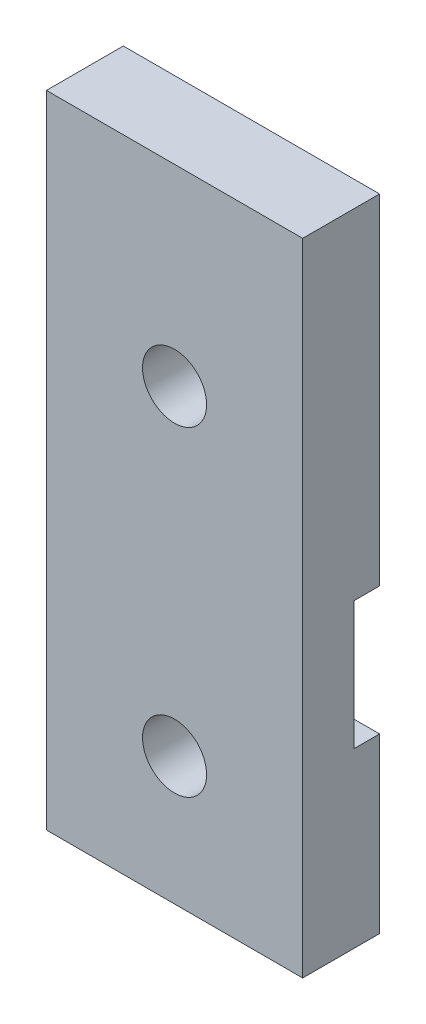
ISO-10303-21;
HEADER;
FILE_DESCRIPTION(('STEP AP214'),'2;1');
FILE_NAME('part.step','',(''),(''),'','','');
FILE_SCHEMA(('AUTOMOTIVE_DESIGN { 1 0 10303 214 1 1 1 1 }'));
ENDSEC;
DATA;
#1=APPLICATION_CONTEXT('core data for automotive mechanical design processes');
#2=APPLICATION_PROTOCOL_DEFINITION('international standard','automotive_design',2000,#1);
#3=PRODUCT_CONTEXT('',#1,'mechanical');
#4=PRODUCT('Part','Part','',(#3));
#5=PRODUCT_RELATED_PRODUCT_CATEGORY('part','',(#4));
#6=PRODUCT_DEFINITION_FORMATION('','',#4);
#7=PRODUCT_DEFINITION_CONTEXT('part definition',#1,'design');
#8=PRODUCT_DEFINITION('design','',#6,#7);
#9=PRODUCT_DEFINITION_SHAPE('','',#8);
#10=(LENGTH_UNIT() NAMED_UNIT(*) SI_UNIT(.MILLI.,.METRE.));
#11=(NAMED_UNIT(*) PLANE_ANGLE_UNIT() SI_UNIT($,.RADIAN.));
#12=(NAMED_UNIT(*) SI_UNIT($,.STERADIAN.) SOLID_ANGLE_UNIT());
#13=UNCERTAINTY_MEASURE_WITH_UNIT(LENGTH_MEASURE(1.E-05),#10,'distance_accuracy_value','');
#14=(GEOMETRIC_REPRESENTATION_CONTEXT(3) GLOBAL_UNCERTAINTY_ASSIGNED_CONTEXT((#13)) GLOBAL_UNIT_ASSIGNED_CONTEXT((#10,
#11,#12)) REPRESENTATION_CONTEXT('',''));
#15=CARTESIAN_POINT('',(0.,0.,0.));
#16=DIRECTION('',(0.,0.,1.));
#17=DIRECTION('',(1.,0.,0.));
#18=AXIS2_PLACEMENT_3D('',#15,#16,#17);
#19=CARTESIAN_POINT('',(3.25000000000008,18.5,2.));
#20=DIRECTION('',(0.,0.,-1.));
#21=DIRECTION('',(-1.,0.,0.));
#22=AXIS2_PLACEMENT_3D('',#19,#20,#21);
#23=CYLINDRICAL_SURFACE('',#22,5.);
#24=CARTESIAN_POINT('',(3.25000000000008,18.5,2.));
#25=DIRECTION('',(0.,0.,1.));
#26=DIRECTION('',(1.,0.,0.));
#27=AXIS2_PLACEMENT_3D('',#24,#25,#26);
#28=CIRCLE('',#27,5.);
#29=CARTESIAN_POINT('',(3.25000000000008,13.5,2.));
#30=VERTEX_POINT('',#29);
#31=CARTESIAN_POINT('',(3.25000000000008,23.5,2.));
#32=VERTEX_POINT('',#31);
#33=EDGE_CURVE('E135',#30,#32,#28,.T.);
#34=ORIENTED_EDGE('',*,*,#33,.T.);
#35=DIRECTION('',(0.,0.,-1.));
#36=VECTOR('',#35,1.);
#37=CARTESIAN_POINT('',(3.25000000000008,23.5,2.));
#38=LINE('',#37,#36);
#39=CARTESIAN_POINT('',(3.25000000000008,23.5,0.));
#40=VERTEX_POINT('',#39);
#41=EDGE_CURVE('E151',#32,#40,#38,.T.);
#42=ORIENTED_EDGE('',*,*,#41,.T.);
#43=CARTESIAN_POINT('',(3.25000000000008,18.5,0.));
#44=DIRECTION('',(0.,0.,1.));
#45=DIRECTION('',(1.,0.,0.));
#46=AXIS2_PLACEMENT_3D('',#43,#44,#45);
#47=CIRCLE('',#46,5.);
#48=CARTESIAN_POINT('',(3.25000000000008,13.5,0.));
#49=VERTEX_POINT('',#48);
#50=EDGE_CURVE('E137',#49,#40,#47,.T.);
#51=ORIENTED_EDGE('',*,*,#50,.F.);
#52=DIRECTION('',(0.,0.,-1.));
#53=VECTOR('',#52,1.);
#54=CARTESIAN_POINT('',(3.25000000000008,13.5,2.));
#55=LINE('',#54,#53);
#56=EDGE_CURVE('E125',#30,#49,#55,.T.);
#57=ORIENTED_EDGE('',*,*,#56,.F.);
#58=EDGE_LOOP('',(#34,#42,#51,#57));
#59=FACE_BOUND('',#58,.T.);
#60=ADVANCED_FACE('F32',(#59),#23,.F.);
#61=CARTESIAN_POINT('',(16.7499999999999,18.5,2.));
#62=DIRECTION('',(0.,0.,-1.));
#63=DIRECTION('',(-1.,0.,0.));
#64=AXIS2_PLACEMENT_3D('',#61,#62,#63);
#65=CYLINDRICAL_SURFACE('',#64,5.);
#66=DIRECTION('',(0.,0.,-1.));
#67=VECTOR('',#66,1.);
#68=CARTESIAN_POINT('',(16.7499999999999,23.5,2.));
#69=LINE('',#68,#67);
#70=CARTESIAN_POINT('',(16.7499999999999,23.5,2.));
#71=VERTEX_POINT('',#70);
#72=CARTESIAN_POINT('',(16.7499999999999,23.5,0.));
#73=VERTEX_POINT('',#72);
#74=EDGE_CURVE('E212',#71,#73,#69,.T.);
#75=ORIENTED_EDGE('',*,*,#74,.F.);
#76=CARTESIAN_POINT('',(16.7499999999999,18.5,2.));
#77=DIRECTION('',(0.,0.,1.));
#78=DIRECTION('',(-1.,0.,0.));
#79=AXIS2_PLACEMENT_3D('',#76,#77,#78);
#80=CIRCLE('',#79,5.);
#81=CARTESIAN_POINT('',(16.7499999999999,13.5,2.));
#82=VERTEX_POINT('',#81);
#83=EDGE_CURVE('E144',#71,#82,#80,.T.);
#84=ORIENTED_EDGE('',*,*,#83,.T.);
#85=DIRECTION('',(0.,0.,-1.));
#86=VECTOR('',#85,1.);
#87=CARTESIAN_POINT('',(16.7499999999999,13.5,2.));
#88=LINE('',#87,#86);
#89=CARTESIAN_POINT('',(16.7499999999999,13.5,0.));
#90=VERTEX_POINT('',#89);
#91=EDGE_CURVE('E213',#82,#90,#88,.T.);
#92=ORIENTED_EDGE('',*,*,#91,.T.);
#93=CARTESIAN_POINT('',(16.7499999999999,18.5,0.));
#94=DIRECTION('',(0.,0.,-1.));
#95=DIRECTION('',(-1.,0.,0.));
#96=AXIS2_PLACEMENT_3D('',#93,#94,#95);
#97=CIRCLE('',#96,5.);
#98=EDGE_CURVE('E40',#73,#90,#97,.F.);
#99=ORIENTED_EDGE('',*,*,#98,.F.);
#100=EDGE_LOOP('',(#75,#84,#92,#99));
#101=FACE_BOUND('',#100,.T.);
#102=ADVANCED_FACE('F211',(#101),#65,.F.);
#103=CARTESIAN_POINT('',(0.,0.,6.));
#104=DIRECTION('',(1.,0.,0.));
#105=DIRECTION('',(0.,0.,-1.));
#106=AXIS2_PLACEMENT_3D('',#103,#104,#105);
#107=PLANE('',#106);
#108=DIRECTION('',(0.,-1.,0.));
#109=VECTOR('',#108,1.);
#110=CARTESIAN_POINT('',(0.,0.,0.));
#111=LINE('',#110,#109);
#112=CARTESIAN_POINT('',(0.,50.,0.));
#113=VERTEX_POINT('',#112);
#114=CARTESIAN_POINT('',(0.,23.5,0.));
#115=VERTEX_POINT('',#114);
#116=EDGE_CURVE('E176',#113,#115,#111,.T.);
#117=ORIENTED_EDGE('',*,*,#116,.T.);
#118=DIRECTION('',(0.,0.,-1.));
#119=VECTOR('',#118,1.);
#120=CARTESIAN_POINT('',(0.,23.5,2.));
#121=LINE('',#120,#119);
#122=CARTESIAN_POINT('',(0.,23.5,2.));
#123=VERTEX_POINT('',#122);
#124=EDGE_CURVE('E228',#123,#115,#121,.T.);
#125=ORIENTED_EDGE('',*,*,#124,.F.);
#126=DIRECTION('',(0.,-1.,0.));
#127=VECTOR('',#126,1.);
#128=CARTESIAN_POINT('',(0.,0.,2.));
#129=LINE('',#128,#127);
#130=CARTESIAN_POINT('',(0.,13.5,2.));
#131=VERTEX_POINT('',#130);
#132=EDGE_CURVE('E140',#123,#131,#129,.T.);
#133=ORIENTED_EDGE('',*,*,#132,.T.);
#134=DIRECTION('',(0.,0.,-1.));
#135=VECTOR('',#134,1.);
#136=CARTESIAN_POINT('',(0.,13.5,2.));
#137=LINE('',#136,#135);
#138=CARTESIAN_POINT('',(0.,13.5,0.));
#139=VERTEX_POINT('',#138);
#140=EDGE_CURVE('E128',#131,#139,#137,.T.);
#141=ORIENTED_EDGE('',*,*,#140,.T.);
#142=CARTESIAN_POINT('',(0.,0.,0.));
#143=VERTEX_POINT('',#142);
#144=EDGE_CURVE('E164',#139,#143,#111,.T.);
#145=ORIENTED_EDGE('',*,*,#144,.T.);
#146=DIRECTION('',(0.,0.,-1.));
#147=VECTOR('',#146,1.);
#148=CARTESIAN_POINT('',(0.,0.,6.));
#149=LINE('',#148,#147);
#150=CARTESIAN_POINT('',(0.,0.,6.));
#151=VERTEX_POINT('',#150);
#152=EDGE_CURVE('E194',#151,#143,#149,.T.);
#153=ORIENTED_EDGE('',*,*,#152,.F.);
#154=DIRECTION('',(0.,-1.,0.));
#155=VECTOR('',#154,1.);
#156=CARTESIAN_POINT('',(0.,0.,6.));
#157=LINE('',#156,#155);
#158=CARTESIAN_POINT('',(0.,50.,6.));
#159=VERTEX_POINT('',#158);
#160=EDGE_CURVE('E165',#159,#151,#157,.T.);
#161=ORIENTED_EDGE('',*,*,#160,.F.);
#162=DIRECTION('',(0.,0.,-1.));
#163=VECTOR('',#162,1.);
#164=CARTESIAN_POINT('',(0.,50.,6.));
#165=LINE('',#164,#163);
#166=EDGE_CURVE('E175',#159,#113,#165,.T.);
#167=ORIENTED_EDGE('',*,*,#166,.T.);
#168=EDGE_LOOP('',(#117,#125,#133,#141,#145,#153,#161,#167));
#169=FACE_BOUND('',#168,.T.);
#170=ADVANCED_FACE('F34',(#169),#107,.F.);
#171=CARTESIAN_POINT('',(20.,0.,6.));
#172=DIRECTION('',(-1.,0.,0.));
#173=DIRECTION('',(0.,0.,1.));
#174=AXIS2_PLACEMENT_3D('',#171,#172,#173);
#175=PLANE('',#174);
#176=DIRECTION('',(0.,-1.,0.));
#177=VECTOR('',#176,1.);
#178=CARTESIAN_POINT('',(20.,0.,2.));
#179=LINE('',#178,#177);
#180=CARTESIAN_POINT('',(20.,23.5,2.));
#181=VERTEX_POINT('',#180);
#182=CARTESIAN_POINT('',(20.,13.5,2.));
#183=VERTEX_POINT('',#182);
#184=EDGE_CURVE('E11',#181,#183,#179,.T.);
#185=ORIENTED_EDGE('',*,*,#184,.F.);
#186=DIRECTION('',(0.,0.,-1.));
#187=VECTOR('',#186,1.);
#188=CARTESIAN_POINT('',(20.,23.5,2.));
#189=LINE('',#188,#187);
#190=CARTESIAN_POINT('',(20.,23.5,0.));
#191=VERTEX_POINT('',#190);
#192=EDGE_CURVE('E215',#181,#191,#189,.T.);
#193=ORIENTED_EDGE('',*,*,#192,.T.);
#194=DIRECTION('',(0.,1.,0.));
#195=VECTOR('',#194,1.);
#196=CARTESIAN_POINT('',(20.,0.,0.));
#197=LINE('',#196,#195);
#198=CARTESIAN_POINT('',(20.,50.,0.));
#199=VERTEX_POINT('',#198);
#200=EDGE_CURVE('E181',#191,#199,#197,.T.);
#201=ORIENTED_EDGE('',*,*,#200,.T.);
#202=DIRECTION('',(0.,0.,-1.));
#203=VECTOR('',#202,1.);
#204=CARTESIAN_POINT('',(20.,50.,6.));
#205=LINE('',#204,#203);
#206=CARTESIAN_POINT('',(20.,50.,6.));
#207=VERTEX_POINT('',#206);
#208=EDGE_CURVE('E188',#207,#199,#205,.T.);
#209=ORIENTED_EDGE('',*,*,#208,.F.);
#210=DIRECTION('',(0.,1.,0.));
#211=VECTOR('',#210,1.);
#212=CARTESIAN_POINT('',(20.,0.,6.));
#213=LINE('',#212,#211);
#214=CARTESIAN_POINT('',(20.,0.,6.));
#215=VERTEX_POINT('',#214);
#216=EDGE_CURVE('E171',#215,#207,#213,.T.);
#217=ORIENTED_EDGE('',*,*,#216,.F.);
#218=DIRECTION('',(0.,0.,-1.));
#219=VECTOR('',#218,1.);
#220=CARTESIAN_POINT('',(20.,0.,6.));
#221=LINE('',#220,#219);
#222=CARTESIAN_POINT('',(20.,0.,0.));
#223=VERTEX_POINT('',#222);
#224=EDGE_CURVE('E191',#215,#223,#221,.T.);
#225=ORIENTED_EDGE('',*,*,#224,.T.);
#226=CARTESIAN_POINT('',(20.,13.5,0.));
#227=VERTEX_POINT('',#226);
#228=EDGE_CURVE('E182',#223,#227,#197,.T.);
#229=ORIENTED_EDGE('',*,*,#228,.T.);
#230=DIRECTION('',(0.,0.,-1.));
#231=VECTOR('',#230,1.);
#232=CARTESIAN_POINT('',(20.,13.5,2.));
#233=LINE('',#232,#231);
#234=EDGE_CURVE('E147',#183,#227,#233,.T.);
#235=ORIENTED_EDGE('',*,*,#234,.F.);
#236=EDGE_LOOP('',(#185,#193,#201,#209,#217,#225,#229,#235));
#237=FACE_BOUND('',#236,.T.);
#238=ADVANCED_FACE('F289',(#237),#175,.F.);
#239=CARTESIAN_POINT('',(0.,0.,6.));
#240=DIRECTION('',(0.,1.,0.));
#241=DIRECTION('',(0.,0.,1.));
#242=AXIS2_PLACEMENT_3D('',#239,#240,#241);
#243=PLANE('',#242);
#244=DIRECTION('',(1.,0.,0.));
#245=VECTOR('',#244,1.);
#246=CARTESIAN_POINT('',(0.,0.,0.));
#247=LINE('',#246,#245);
#248=EDGE_CURVE('E179',#143,#223,#247,.T.);
#249=ORIENTED_EDGE('',*,*,#248,.T.);
#250=ORIENTED_EDGE('',*,*,#224,.F.);
#251=DIRECTION('',(1.,0.,0.));
#252=VECTOR('',#251,1.);
#253=CARTESIAN_POINT('',(0.,0.,6.));
#254=LINE('',#253,#252);
#255=EDGE_CURVE('E168',#151,#215,#254,.T.);
#256=ORIENTED_EDGE('',*,*,#255,.F.);
#257=ORIENTED_EDGE('',*,*,#152,.T.);
#258=EDGE_LOOP('',(#249,#250,#256,#257));
#259=FACE_BOUND('',#258,.T.);
#260=ADVANCED_FACE('F240',(#259),#243,.F.);
#261=CARTESIAN_POINT('',(0.,50.,6.));
#262=DIRECTION('',(0.,-1.,0.));
#263=DIRECTION('',(0.,0.,-1.));
#264=AXIS2_PLACEMENT_3D('',#261,#262,#263);
#265=PLANE('',#264);
#266=DIRECTION('',(-1.,0.,0.));
#267=VECTOR('',#266,1.);
#268=CARTESIAN_POINT('',(0.,50.,0.));
#269=LINE('',#268,#267);
#270=EDGE_CURVE('E169',#199,#113,#269,.T.);
#271=ORIENTED_EDGE('',*,*,#270,.T.);
#272=ORIENTED_EDGE('',*,*,#166,.F.);
#273=DIRECTION('',(-1.,0.,0.));
#274=VECTOR('',#273,1.);
#275=CARTESIAN_POINT('',(0.,50.,6.));
#276=LINE('',#275,#274);
#277=EDGE_CURVE('E173',#207,#159,#276,.T.);
#278=ORIENTED_EDGE('',*,*,#277,.F.);
#279=ORIENTED_EDGE('',*,*,#208,.T.);
#280=EDGE_LOOP('',(#271,#272,#278,#279));
#281=FACE_BOUND('',#280,.T.);
#282=ADVANCED_FACE('F250',(#281),#265,.F.);
#283=CARTESIAN_POINT('',(0.,0.,6.));
#284=DIRECTION('',(0.,0.,-1.));
#285=DIRECTION('',(-1.,0.,0.));
#286=AXIS2_PLACEMENT_3D('',#283,#284,#285);
#287=PLANE('',#286);
#288=CARTESIAN_POINT('',(10.0000000000083,34.9999999999969,6.));
#289=DIRECTION('',(0.,0.,-1.));
#290=DIRECTION('',(-1.,0.,0.));
#291=AXIS2_PLACEMENT_3D('',#288,#289,#290);
#292=CIRCLE('',#291,2.5);
#293=CARTESIAN_POINT('',(7.50000000000833,34.9999999999969,6.));
#294=VERTEX_POINT('',#293);
#295=EDGE_CURVE('E161',#294,#294,#292,.T.);
#296=ORIENTED_EDGE('',*,*,#295,.T.);
#297=EDGE_LOOP('',(#296));
#298=FACE_BOUND('',#297,.T.);
#299=CARTESIAN_POINT('',(10.0000000000083,10.,6.));
#300=DIRECTION('',(0.,0.,-1.));
#301=DIRECTION('',(-1.,0.,0.));
#302=AXIS2_PLACEMENT_3D('',#299,#300,#301);
#303=CIRCLE('',#302,2.5);
#304=CARTESIAN_POINT('',(7.50000000000832,10.,6.));
#305=VERTEX_POINT('',#304);
#306=EDGE_CURVE('E156',#305,#305,#303,.T.);
#307=ORIENTED_EDGE('',*,*,#306,.T.);
#308=EDGE_LOOP('',(#307));
#309=FACE_BOUND('',#308,.T.);
#310=ORIENTED_EDGE('',*,*,#160,.T.);
#311=ORIENTED_EDGE('',*,*,#255,.T.);
#312=ORIENTED_EDGE('',*,*,#216,.T.);
#313=ORIENTED_EDGE('',*,*,#277,.T.);
#314=EDGE_LOOP('',(#310,#311,#312,#313));
#315=FACE_BOUND('',#314,.T.);
#316=ADVANCED_FACE('F245',(#298,#309,#315),#287,.F.);
#317=CARTESIAN_POINT('',(0.,0.,0.));
#318=DIRECTION('',(0.,0.,-1.));
#319=DIRECTION('',(-1.,0.,0.));
#320=AXIS2_PLACEMENT_3D('',#317,#318,#319);
#321=PLANE('',#320);
#322=DIRECTION('',(1.,0.,0.));
#323=VECTOR('',#322,1.);
#324=CARTESIAN_POINT('',(3.25000000000008,23.5,0.));
#325=LINE('',#324,#323);
#326=EDGE_CURVE('E129',#115,#40,#325,.T.);
#327=ORIENTED_EDGE('',*,*,#326,.F.);
#328=ORIENTED_EDGE('',*,*,#116,.F.);
#329=ORIENTED_EDGE('',*,*,#270,.F.);
#330=ORIENTED_EDGE('',*,*,#200,.F.);
#331=DIRECTION('',(1.,0.,0.));
#332=VECTOR('',#331,1.);
#333=CARTESIAN_POINT('',(16.7499999999999,23.5,0.));
#334=LINE('',#333,#332);
#335=EDGE_CURVE('E207',#73,#191,#334,.T.);
#336=ORIENTED_EDGE('',*,*,#335,.F.);
#337=ORIENTED_EDGE('',*,*,#98,.T.);
#338=DIRECTION('',(-1.,0.,0.));
#339=VECTOR('',#338,1.);
#340=CARTESIAN_POINT('',(20.,13.5,0.));
#341=LINE('',#340,#339);
#342=EDGE_CURVE('E205',#227,#90,#341,.T.);
#343=ORIENTED_EDGE('',*,*,#342,.F.);
#344=ORIENTED_EDGE('',*,*,#228,.F.);
#345=ORIENTED_EDGE('',*,*,#248,.F.);
#346=ORIENTED_EDGE('',*,*,#144,.F.);
#347=DIRECTION('',(-1.,0.,0.));
#348=VECTOR('',#347,1.);
#349=CARTESIAN_POINT('',(0.,13.5,0.));
#350=LINE('',#349,#348);
#351=EDGE_CURVE('E221',#49,#139,#350,.T.);
#352=ORIENTED_EDGE('',*,*,#351,.F.);
#353=ORIENTED_EDGE('',*,*,#50,.T.);
#354=EDGE_LOOP('',(#327,#328,#329,#330,#336,#337,#343,#344,#345,#346,#352,#353));
#355=FACE_BOUND('',#354,.T.);
#356=CARTESIAN_POINT('',(10.0000000000083,34.9999999999969,0.));
#357=DIRECTION('',(0.,0.,-1.));
#358=DIRECTION('',(-1.,0.,0.));
#359=AXIS2_PLACEMENT_3D('',#356,#357,#358);
#360=CIRCLE('',#359,2.5);
#361=CARTESIAN_POINT('',(7.50000000000833,34.9999999999969,0.));
#362=VERTEX_POINT('',#361);
#363=EDGE_CURVE('E153',#362,#362,#360,.T.);
#364=ORIENTED_EDGE('',*,*,#363,.F.);
#365=EDGE_LOOP('',(#364));
#366=FACE_BOUND('',#365,.T.);
#367=CARTESIAN_POINT('',(10.0000000000083,10.,0.));
#368=DIRECTION('',(0.,0.,-1.));
#369=DIRECTION('',(-1.,0.,0.));
#370=AXIS2_PLACEMENT_3D('',#367,#368,#369);
#371=CIRCLE('',#370,2.5);
#372=CARTESIAN_POINT('',(7.50000000000832,10.,0.));
#373=VERTEX_POINT('',#372);
#374=EDGE_CURVE('E142',#373,#373,#371,.T.);
#375=ORIENTED_EDGE('',*,*,#374,.F.);
#376=EDGE_LOOP('',(#375));
#377=FACE_BOUND('',#376,.T.);
#378=ADVANCED_FACE('F202',(#355,#366,#377),#321,.T.);
#379=CARTESIAN_POINT('',(10.0000000000083,10.,10.));
#380=DIRECTION('',(0.,0.,-1.));
#381=DIRECTION('',(-1.,0.,0.));
#382=AXIS2_PLACEMENT_3D('',#379,#380,#381);
#383=CYLINDRICAL_SURFACE('',#382,2.5);
#384=ORIENTED_EDGE('',*,*,#374,.T.);
#385=EDGE_LOOP('',(#384));
#386=FACE_BOUND('',#385,.T.);
#387=ORIENTED_EDGE('',*,*,#306,.F.);
#388=EDGE_LOOP('',(#387));
#389=FACE_BOUND('',#388,.T.);
#390=ADVANCED_FACE('F277',(#386,#389),#383,.F.);
#391=CARTESIAN_POINT('',(10.0000000000083,34.9999999999969,10.));
#392=DIRECTION('',(0.,0.,-1.));
#393=DIRECTION('',(-1.,0.,0.));
#394=AXIS2_PLACEMENT_3D('',#391,#392,#393);
#395=CYLINDRICAL_SURFACE('',#394,2.5);
#396=ORIENTED_EDGE('',*,*,#363,.T.);
#397=EDGE_LOOP('',(#396));
#398=FACE_BOUND('',#397,.T.);
#399=ORIENTED_EDGE('',*,*,#295,.F.);
#400=EDGE_LOOP('',(#399));
#401=FACE_BOUND('',#400,.T.);
#402=ADVANCED_FACE('F274',(#398,#401),#395,.F.);
#403=CARTESIAN_POINT('',(3.25000000000008,18.5,2.));
#404=DIRECTION('',(0.,0.,1.));
#405=DIRECTION('',(1.,0.,0.));
#406=AXIS2_PLACEMENT_3D('',#403,#404,#405);
#407=PLANE('',#406);
#408=ORIENTED_EDGE('',*,*,#33,.F.);
#409=DIRECTION('',(-1.,0.,0.));
#410=VECTOR('',#409,1.);
#411=CARTESIAN_POINT('',(0.,13.5,2.));
#412=LINE('',#411,#410);
#413=EDGE_CURVE('E122',#30,#131,#412,.T.);
#414=ORIENTED_EDGE('',*,*,#413,.T.);
#415=ORIENTED_EDGE('',*,*,#132,.F.);
#416=DIRECTION('',(1.,0.,0.));
#417=VECTOR('',#416,1.);
#418=CARTESIAN_POINT('',(3.25000000000008,23.5,2.));
#419=LINE('',#418,#417);
#420=EDGE_CURVE('E47',#123,#32,#419,.T.);
#421=ORIENTED_EDGE('',*,*,#420,.T.);
#422=EDGE_LOOP('',(#408,#414,#415,#421));
#423=FACE_BOUND('',#422,.T.);
#424=ADVANCED_FACE('F139',(#423),#407,.F.);
#425=CARTESIAN_POINT('',(16.7499999999999,18.5,2.));
#426=DIRECTION('',(0.,0.,-1.));
#427=DIRECTION('',(-1.,0.,0.));
#428=AXIS2_PLACEMENT_3D('',#425,#426,#427);
#429=PLANE('',#428);
#430=ORIENTED_EDGE('',*,*,#83,.F.);
#431=DIRECTION('',(1.,0.,0.));
#432=VECTOR('',#431,1.);
#433=CARTESIAN_POINT('',(16.7499999999999,23.5,2.));
#434=LINE('',#433,#432);
#435=EDGE_CURVE('E217',#71,#181,#434,.T.);
#436=ORIENTED_EDGE('',*,*,#435,.T.);
#437=ORIENTED_EDGE('',*,*,#184,.T.);
#438=DIRECTION('',(-1.,0.,0.));
#439=VECTOR('',#438,1.);
#440=CARTESIAN_POINT('',(20.,13.5,2.));
#441=LINE('',#440,#439);
#442=EDGE_CURVE('E54',#183,#82,#441,.T.);
#443=ORIENTED_EDGE('',*,*,#442,.T.);
#444=EDGE_LOOP('',(#430,#436,#437,#443));
#445=FACE_BOUND('',#444,.T.);
#446=ADVANCED_FACE('F270',(#445),#429,.T.);
#447=CARTESIAN_POINT('',(20.,13.5,2.));
#448=DIRECTION('',(0.,-1.,0.));
#449=DIRECTION('',(0.,0.,-1.));
#450=AXIS2_PLACEMENT_3D('',#447,#448,#449);
#451=PLANE('',#450);
#452=ORIENTED_EDGE('',*,*,#342,.T.);
#453=ORIENTED_EDGE('',*,*,#91,.F.);
#454=ORIENTED_EDGE('',*,*,#442,.F.);
#455=ORIENTED_EDGE('',*,*,#234,.T.);
#456=EDGE_LOOP('',(#452,#453,#454,#455));
#457=FACE_BOUND('',#456,.T.);
#458=ADVANCED_FACE('F272',(#457),#451,.F.);
#459=CARTESIAN_POINT('',(16.7499999999999,23.5,2.));
#460=DIRECTION('',(0.,1.,0.));
#461=DIRECTION('',(0.,0.,1.));
#462=AXIS2_PLACEMENT_3D('',#459,#460,#461);
#463=PLANE('',#462);
#464=ORIENTED_EDGE('',*,*,#335,.T.);
#465=ORIENTED_EDGE('',*,*,#192,.F.);
#466=ORIENTED_EDGE('',*,*,#435,.F.);
#467=ORIENTED_EDGE('',*,*,#74,.T.);
#468=EDGE_LOOP('',(#464,#465,#466,#467));
#469=FACE_BOUND('',#468,.T.);
#470=ADVANCED_FACE('F259',(#469),#463,.F.);
#471=CARTESIAN_POINT('',(0.,13.5,2.));
#472=DIRECTION('',(0.,-1.,0.));
#473=DIRECTION('',(0.,0.,-1.));
#474=AXIS2_PLACEMENT_3D('',#471,#472,#473);
#475=PLANE('',#474);
#476=ORIENTED_EDGE('',*,*,#351,.T.);
#477=ORIENTED_EDGE('',*,*,#140,.F.);
#478=ORIENTED_EDGE('',*,*,#413,.F.);
#479=ORIENTED_EDGE('',*,*,#56,.T.);
#480=EDGE_LOOP('',(#476,#477,#478,#479));
#481=FACE_BOUND('',#480,.T.);
#482=ADVANCED_FACE('F124',(#481),#475,.F.);
#483=CARTESIAN_POINT('',(3.25000000000008,23.5,2.));
#484=DIRECTION('',(0.,1.,0.));
#485=DIRECTION('',(0.,0.,1.));
#486=AXIS2_PLACEMENT_3D('',#483,#484,#485);
#487=PLANE('',#486);
#488=ORIENTED_EDGE('',*,*,#326,.T.);
#489=ORIENTED_EDGE('',*,*,#41,.F.);
#490=ORIENTED_EDGE('',*,*,#420,.F.);
#491=ORIENTED_EDGE('',*,*,#124,.T.);
#492=EDGE_LOOP('',(#488,#489,#490,#491));
#493=FACE_BOUND('',#492,.T.);
#494=ADVANCED_FACE('F253',(#493),#487,.F.);
#495=CLOSED_SHELL('',(#60,#102,#170,#238,#260,#282,#316,#378,#390,#402,#424,#446,#458,#470,#482,#494));
#496=MANIFOLD_SOLID_BREP('B2',#495);
#497=ADVANCED_BREP_SHAPE_REPRESENTATION('',(#18,#496),#14);
#498=SHAPE_DEFINITION_REPRESENTATION(#9,#497);
ENDSEC;
END-ISO-10303-21;
